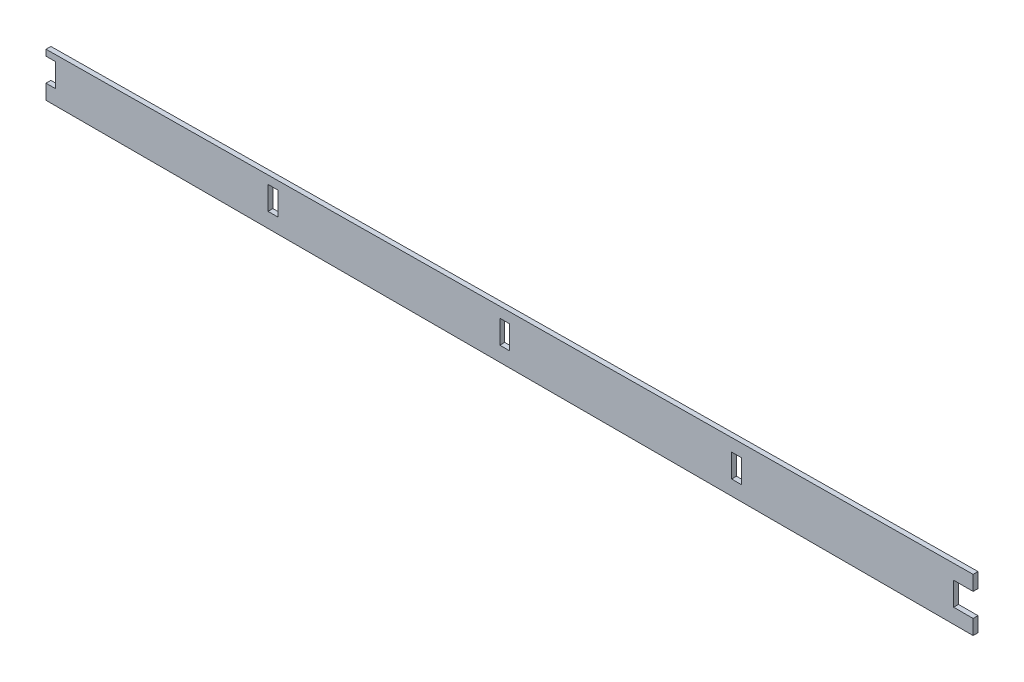
ISO-10303-21;
HEADER;
FILE_DESCRIPTION(('STEP AP214'),'2;1');
FILE_NAME('part.step','',(''),(''),'','','');
FILE_SCHEMA(('AUTOMOTIVE_DESIGN { 1 0 10303 214 1 1 1 1 }'));
ENDSEC;
DATA;
#1=APPLICATION_CONTEXT('core data for automotive mechanical design processes');
#2=APPLICATION_PROTOCOL_DEFINITION('international standard','automotive_design',2000,#1);
#3=PRODUCT_CONTEXT('',#1,'mechanical');
#4=PRODUCT('Part','Part','',(#3));
#5=PRODUCT_RELATED_PRODUCT_CATEGORY('part','',(#4));
#6=PRODUCT_DEFINITION_FORMATION('','',#4);
#7=PRODUCT_DEFINITION_CONTEXT('part definition',#1,'design');
#8=PRODUCT_DEFINITION('design','',#6,#7);
#9=PRODUCT_DEFINITION_SHAPE('','',#8);
#10=(LENGTH_UNIT() NAMED_UNIT(*) SI_UNIT(.MILLI.,.METRE.));
#11=(NAMED_UNIT(*) PLANE_ANGLE_UNIT() SI_UNIT($,.RADIAN.));
#12=(NAMED_UNIT(*) SI_UNIT($,.STERADIAN.) SOLID_ANGLE_UNIT());
#13=UNCERTAINTY_MEASURE_WITH_UNIT(LENGTH_MEASURE(1.E-05),#10,'distance_accuracy_value','');
#14=(GEOMETRIC_REPRESENTATION_CONTEXT(3) GLOBAL_UNCERTAINTY_ASSIGNED_CONTEXT((#13)) GLOBAL_UNIT_ASSIGNED_CONTEXT((#10,
#11,#12)) REPRESENTATION_CONTEXT('',''));
#15=CARTESIAN_POINT('',(0.,0.,0.));
#16=DIRECTION('',(0.,0.,1.));
#17=DIRECTION('',(1.,0.,0.));
#18=AXIS2_PLACEMENT_3D('',#15,#16,#17);
#19=CARTESIAN_POINT('',(0.,0.,1.5875));
#20=DIRECTION('',(0.,0.,-1.));
#21=DIRECTION('',(-1.,0.,0.));
#22=AXIS2_PLACEMENT_3D('',#19,#20,#21);
#23=PLANE('',#22);
#24=DIRECTION('',(0.,1.,0.));
#25=VECTOR('',#24,1.);
#26=CARTESIAN_POINT('',(-62.8042565693099,25.0075839146697,1.5875));
#27=LINE('',#26,#25);
#28=CARTESIAN_POINT('',(-62.8042565693099,25.0075839146697,1.5875));
#29=VERTEX_POINT('',#28);
#30=CARTESIAN_POINT('',(-62.8042565693098,32.6275839146696,1.5875));
#31=VERTEX_POINT('',#30);
#32=EDGE_CURVE('E229',#29,#31,#27,.T.);
#33=ORIENTED_EDGE('',*,*,#32,.F.);
#34=DIRECTION('',(1.,0.,0.));
#35=VECTOR('',#34,1.);
#36=CARTESIAN_POINT('',(-65.9792565693098,25.0075839146697,1.5875));
#37=LINE('',#36,#35);
#38=CARTESIAN_POINT('',(-65.9792565693098,25.0075839146697,1.5875));
#39=VERTEX_POINT('',#38);
#40=EDGE_CURVE('E237',#39,#29,#37,.T.);
#41=ORIENTED_EDGE('',*,*,#40,.F.);
#42=DIRECTION('',(0.,-1.,0.));
#43=VECTOR('',#42,1.);
#44=CARTESIAN_POINT('',(-65.9792565693098,32.6275839146697,1.5875));
#45=LINE('',#44,#43);
#46=CARTESIAN_POINT('',(-65.9792565693098,32.6275839146697,1.5875));
#47=VERTEX_POINT('',#46);
#48=EDGE_CURVE('E234',#47,#39,#45,.T.);
#49=ORIENTED_EDGE('',*,*,#48,.F.);
#50=DIRECTION('',(-1.,0.,0.));
#51=VECTOR('',#50,1.);
#52=CARTESIAN_POINT('',(-62.8042565693098,32.6275839146696,1.5875));
#53=LINE('',#52,#51);
#54=EDGE_CURVE('E231',#31,#47,#53,.T.);
#55=ORIENTED_EDGE('',*,*,#54,.F.);
#56=EDGE_LOOP('',(#33,#41,#49,#55));
#57=FACE_BOUND('',#56,.T.);
#58=DIRECTION('',(0.,1.,0.));
#59=VECTOR('',#58,1.);
#60=CARTESIAN_POINT('',(88.3257434306901,37.4664794760637,1.5875));
#61=LINE('',#60,#59);
#62=CARTESIAN_POINT('',(88.3257434306901,32.6275839146697,1.5875));
#63=VERTEX_POINT('',#62);
#64=CARTESIAN_POINT('',(88.3257434306901,37.4664794760637,1.5875));
#65=VERTEX_POINT('',#64);
#66=EDGE_CURVE('E291',#63,#65,#61,.T.);
#67=ORIENTED_EDGE('',*,*,#66,.T.);
#68=DIRECTION('',(-0.99995490736833,-0.00949648513894938,0.));
#69=VECTOR('',#68,1.);
#70=CARTESIAN_POINT('',(-213.93425656931,34.5959424378955,1.5875));
#71=LINE('',#70,#69);
#72=CARTESIAN_POINT('',(-213.93425656931,34.5959424378955,1.5875));
#73=VERTEX_POINT('',#72);
#74=EDGE_CURVE('E294',#65,#73,#71,.T.);
#75=ORIENTED_EDGE('',*,*,#74,.T.);
#76=DIRECTION('',(0.,-1.,0.));
#77=VECTOR('',#76,1.);
#78=CARTESIAN_POINT('',(-213.93425656931,32.6275839146697,1.5875));
#79=LINE('',#78,#77);
#80=CARTESIAN_POINT('',(-213.93425656931,32.6275839146697,1.5875));
#81=VERTEX_POINT('',#80);
#82=EDGE_CURVE('E297',#73,#81,#79,.T.);
#83=ORIENTED_EDGE('',*,*,#82,.T.);
#84=DIRECTION('',(1.,0.,0.));
#85=VECTOR('',#84,1.);
#86=CARTESIAN_POINT('',(-210.75925656931,32.6275839146697,1.5875));
#87=LINE('',#86,#85);
#88=CARTESIAN_POINT('',(-210.75925656931,32.6275839146697,1.5875));
#89=VERTEX_POINT('',#88);
#90=EDGE_CURVE('E299',#81,#89,#87,.T.);
#91=ORIENTED_EDGE('',*,*,#90,.T.);
#92=DIRECTION('',(0.,-1.,0.));
#93=VECTOR('',#92,1.);
#94=CARTESIAN_POINT('',(-210.75925656931,25.0075839146697,1.5875));
#95=LINE('',#94,#93);
#96=CARTESIAN_POINT('',(-210.75925656931,25.0075839146697,1.5875));
#97=VERTEX_POINT('',#96);
#98=EDGE_CURVE('E301',#89,#97,#95,.T.);
#99=ORIENTED_EDGE('',*,*,#98,.T.);
#100=DIRECTION('',(-1.,0.,0.));
#101=VECTOR('',#100,1.);
#102=CARTESIAN_POINT('',(-213.93425656931,25.0075839146697,1.5875));
#103=LINE('',#102,#101);
#104=CARTESIAN_POINT('',(-213.93425656931,25.0075839146697,1.5875));
#105=VERTEX_POINT('',#104);
#106=EDGE_CURVE('E303',#97,#105,#103,.T.);
#107=ORIENTED_EDGE('',*,*,#106,.T.);
#108=DIRECTION('',(0.,-1.,0.));
#109=VECTOR('',#108,1.);
#110=CARTESIAN_POINT('',(-213.93425656931,20.1686521639343,1.5875));
#111=LINE('',#110,#109);
#112=CARTESIAN_POINT('',(-213.93425656931,20.1686521639343,1.5875));
#113=VERTEX_POINT('',#112);
#114=EDGE_CURVE('E305',#105,#113,#111,.T.);
#115=ORIENTED_EDGE('',*,*,#114,.T.);
#116=DIRECTION('',(1.,0.,0.));
#117=VECTOR('',#116,1.);
#118=CARTESIAN_POINT('',(88.3257434306901,20.1686521639343,1.5875));
#119=LINE('',#118,#117);
#120=CARTESIAN_POINT('',(88.3257434306901,20.1686521639343,1.5875));
#121=VERTEX_POINT('',#120);
#122=EDGE_CURVE('E307',#113,#121,#119,.T.);
#123=ORIENTED_EDGE('',*,*,#122,.T.);
#124=DIRECTION('',(0.,1.,0.));
#125=VECTOR('',#124,1.);
#126=CARTESIAN_POINT('',(88.3257434306901,25.0075839146696,1.5875));
#127=LINE('',#126,#125);
#128=CARTESIAN_POINT('',(88.3257434306901,25.0075839146696,1.5875));
#129=VERTEX_POINT('',#128);
#130=EDGE_CURVE('E309',#121,#129,#127,.T.);
#131=ORIENTED_EDGE('',*,*,#130,.T.);
#132=DIRECTION('',(-1.,0.,0.));
#133=VECTOR('',#132,1.);
#134=CARTESIAN_POINT('',(81.9757434306901,25.0075839146697,1.5875));
#135=LINE('',#134,#133);
#136=CARTESIAN_POINT('',(81.9757434306901,25.0075839146697,1.5875));
#137=VERTEX_POINT('',#136);
#138=EDGE_CURVE('E311',#129,#137,#135,.T.);
#139=ORIENTED_EDGE('',*,*,#138,.T.);
#140=DIRECTION('',(0.,1.,0.));
#141=VECTOR('',#140,1.);
#142=CARTESIAN_POINT('',(81.9757434306901,32.6275839146697,1.5875));
#143=LINE('',#142,#141);
#144=CARTESIAN_POINT('',(81.9757434306901,32.6275839146697,1.5875));
#145=VERTEX_POINT('',#144);
#146=EDGE_CURVE('E313',#137,#145,#143,.T.);
#147=ORIENTED_EDGE('',*,*,#146,.T.);
#148=DIRECTION('',(1.,0.,0.));
#149=VECTOR('',#148,1.);
#150=CARTESIAN_POINT('',(88.3257434306901,32.6275839146697,1.5875));
#151=LINE('',#150,#149);
#152=EDGE_CURVE('E315',#145,#63,#151,.T.);
#153=ORIENTED_EDGE('',*,*,#152,.T.);
#154=EDGE_LOOP('',(#67,#75,#83,#91,#99,#107,#115,#123,#131,#139,#147,#153));
#155=FACE_BOUND('',#154,.T.);
#156=DIRECTION('',(0.,1.,0.));
#157=VECTOR('',#156,1.);
#158=CARTESIAN_POINT('',(-138.36925656931,32.6275839146697,1.5875));
#159=LINE('',#158,#157);
#160=CARTESIAN_POINT('',(-138.36925656931,25.0075839146697,1.5875));
#161=VERTEX_POINT('',#160);
#162=CARTESIAN_POINT('',(-138.36925656931,32.6275839146697,1.5875));
#163=VERTEX_POINT('',#162);
#164=EDGE_CURVE('E260',#161,#163,#159,.T.);
#165=ORIENTED_EDGE('',*,*,#164,.F.);
#166=DIRECTION('',(1.,0.,0.));
#167=VECTOR('',#166,1.);
#168=CARTESIAN_POINT('',(-138.36925656931,25.0075839146697,1.5875));
#169=LINE('',#168,#167);
#170=CARTESIAN_POINT('',(-141.54425656931,25.0075839146696,1.5875));
#171=VERTEX_POINT('',#170);
#172=EDGE_CURVE('E268',#171,#161,#169,.T.);
#173=ORIENTED_EDGE('',*,*,#172,.F.);
#174=DIRECTION('',(0.,-1.,0.));
#175=VECTOR('',#174,1.);
#176=CARTESIAN_POINT('',(-141.54425656931,25.0075839146696,1.5875));
#177=LINE('',#176,#175);
#178=CARTESIAN_POINT('',(-141.54425656931,32.6275839146697,1.5875));
#179=VERTEX_POINT('',#178);
#180=EDGE_CURVE('E265',#179,#171,#177,.T.);
#181=ORIENTED_EDGE('',*,*,#180,.F.);
#182=DIRECTION('',(-1.,0.,0.));
#183=VECTOR('',#182,1.);
#184=CARTESIAN_POINT('',(-141.54425656931,32.6275839146697,1.5875));
#185=LINE('',#184,#183);
#186=EDGE_CURVE('E262',#163,#179,#185,.T.);
#187=ORIENTED_EDGE('',*,*,#186,.F.);
#188=EDGE_LOOP('',(#165,#173,#181,#187));
#189=FACE_BOUND('',#188,.T.);
#190=DIRECTION('',(-1.,0.,0.));
#191=VECTOR('',#190,1.);
#192=CARTESIAN_POINT('',(9.5857434306901,32.6275839146697,1.5875));
#193=LINE('',#192,#191);
#194=CARTESIAN_POINT('',(12.7607434306901,32.6275839146697,1.5875));
#195=VERTEX_POINT('',#194);
#196=CARTESIAN_POINT('',(9.5857434306901,32.6275839146697,1.5875));
#197=VERTEX_POINT('',#196);
#198=EDGE_CURVE('E193',#195,#197,#193,.T.);
#199=ORIENTED_EDGE('',*,*,#198,.F.);
#200=DIRECTION('',(0.,1.,0.));
#201=VECTOR('',#200,1.);
#202=CARTESIAN_POINT('',(12.7607434306901,32.6275839146697,1.5875));
#203=LINE('',#202,#201);
#204=CARTESIAN_POINT('',(12.7607434306901,25.0075839146697,1.5875));
#205=VERTEX_POINT('',#204);
#206=EDGE_CURVE('E215',#205,#195,#203,.T.);
#207=ORIENTED_EDGE('',*,*,#206,.F.);
#208=DIRECTION('',(1.,0.,0.));
#209=VECTOR('',#208,1.);
#210=CARTESIAN_POINT('',(12.7607434306901,25.0075839146697,1.5875));
#211=LINE('',#210,#209);
#212=CARTESIAN_POINT('',(9.5857434306901,25.0075839146697,1.5875));
#213=VERTEX_POINT('',#212);
#214=EDGE_CURVE('E213',#213,#205,#211,.T.);
#215=ORIENTED_EDGE('',*,*,#214,.F.);
#216=DIRECTION('',(0.,-1.,0.));
#217=VECTOR('',#216,1.);
#218=CARTESIAN_POINT('',(9.5857434306901,25.0075839146697,1.5875));
#219=LINE('',#218,#217);
#220=EDGE_CURVE('E201',#197,#213,#219,.T.);
#221=ORIENTED_EDGE('',*,*,#220,.F.);
#222=EDGE_LOOP('',(#199,#207,#215,#221));
#223=FACE_BOUND('',#222,.T.);
#224=ADVANCED_FACE('F32',(#57,#155,#189,#223),#23,.F.);
#225=CARTESIAN_POINT('',(0.,0.,0.));
#226=DIRECTION('',(0.,0.,-1.));
#227=DIRECTION('',(-1.,0.,0.));
#228=AXIS2_PLACEMENT_3D('',#225,#226,#227);
#229=PLANE('',#228);
#230=DIRECTION('',(0.,1.,0.));
#231=VECTOR('',#230,1.);
#232=CARTESIAN_POINT('',(88.3257434306901,37.4664794760637,0.));
#233=LINE('',#232,#231);
#234=CARTESIAN_POINT('',(88.3257434306901,32.6275839146697,0.));
#235=VERTEX_POINT('',#234);
#236=CARTESIAN_POINT('',(88.3257434306901,37.4664794760637,0.));
#237=VERTEX_POINT('',#236);
#238=EDGE_CURVE('E290',#235,#237,#233,.T.);
#239=ORIENTED_EDGE('',*,*,#238,.F.);
#240=DIRECTION('',(1.,0.,0.));
#241=VECTOR('',#240,1.);
#242=CARTESIAN_POINT('',(88.3257434306901,32.6275839146697,0.));
#243=LINE('',#242,#241);
#244=CARTESIAN_POINT('',(81.9757434306901,32.6275839146697,0.));
#245=VERTEX_POINT('',#244);
#246=EDGE_CURVE('E295',#245,#235,#243,.T.);
#247=ORIENTED_EDGE('',*,*,#246,.F.);
#248=DIRECTION('',(0.,1.,0.));
#249=VECTOR('',#248,1.);
#250=CARTESIAN_POINT('',(81.9757434306901,32.6275839146697,0.));
#251=LINE('',#250,#249);
#252=CARTESIAN_POINT('',(81.9757434306901,25.0075839146697,0.));
#253=VERTEX_POINT('',#252);
#254=EDGE_CURVE('E338',#253,#245,#251,.T.);
#255=ORIENTED_EDGE('',*,*,#254,.F.);
#256=DIRECTION('',(-1.,0.,0.));
#257=VECTOR('',#256,1.);
#258=CARTESIAN_POINT('',(81.9757434306901,25.0075839146697,0.));
#259=LINE('',#258,#257);
#260=CARTESIAN_POINT('',(88.3257434306901,25.0075839146696,0.));
#261=VERTEX_POINT('',#260);
#262=EDGE_CURVE('E336',#261,#253,#259,.T.);
#263=ORIENTED_EDGE('',*,*,#262,.F.);
#264=DIRECTION('',(0.,1.,0.));
#265=VECTOR('',#264,1.);
#266=CARTESIAN_POINT('',(88.3257434306901,25.0075839146696,0.));
#267=LINE('',#266,#265);
#268=CARTESIAN_POINT('',(88.3257434306901,20.1686521639343,0.));
#269=VERTEX_POINT('',#268);
#270=EDGE_CURVE('E334',#269,#261,#267,.T.);
#271=ORIENTED_EDGE('',*,*,#270,.F.);
#272=DIRECTION('',(1.,0.,0.));
#273=VECTOR('',#272,1.);
#274=CARTESIAN_POINT('',(88.3257434306901,20.1686521639343,0.));
#275=LINE('',#274,#273);
#276=CARTESIAN_POINT('',(-213.93425656931,20.1686521639343,0.));
#277=VERTEX_POINT('',#276);
#278=EDGE_CURVE('E332',#277,#269,#275,.T.);
#279=ORIENTED_EDGE('',*,*,#278,.F.);
#280=DIRECTION('',(0.,-1.,0.));
#281=VECTOR('',#280,1.);
#282=CARTESIAN_POINT('',(-213.93425656931,20.1686521639343,0.));
#283=LINE('',#282,#281);
#284=CARTESIAN_POINT('',(-213.93425656931,25.0075839146697,0.));
#285=VERTEX_POINT('',#284);
#286=EDGE_CURVE('E330',#285,#277,#283,.T.);
#287=ORIENTED_EDGE('',*,*,#286,.F.);
#288=DIRECTION('',(-1.,0.,0.));
#289=VECTOR('',#288,1.);
#290=CARTESIAN_POINT('',(-213.93425656931,25.0075839146697,0.));
#291=LINE('',#290,#289);
#292=CARTESIAN_POINT('',(-210.75925656931,25.0075839146697,0.));
#293=VERTEX_POINT('',#292);
#294=EDGE_CURVE('E328',#293,#285,#291,.T.);
#295=ORIENTED_EDGE('',*,*,#294,.F.);
#296=DIRECTION('',(0.,-1.,0.));
#297=VECTOR('',#296,1.);
#298=CARTESIAN_POINT('',(-210.75925656931,25.0075839146697,0.));
#299=LINE('',#298,#297);
#300=CARTESIAN_POINT('',(-210.75925656931,32.6275839146697,0.));
#301=VERTEX_POINT('',#300);
#302=EDGE_CURVE('E326',#301,#293,#299,.T.);
#303=ORIENTED_EDGE('',*,*,#302,.F.);
#304=DIRECTION('',(1.,0.,0.));
#305=VECTOR('',#304,1.);
#306=CARTESIAN_POINT('',(-210.75925656931,32.6275839146697,0.));
#307=LINE('',#306,#305);
#308=CARTESIAN_POINT('',(-213.93425656931,32.6275839146697,0.));
#309=VERTEX_POINT('',#308);
#310=EDGE_CURVE('E324',#309,#301,#307,.T.);
#311=ORIENTED_EDGE('',*,*,#310,.F.);
#312=DIRECTION('',(0.,-1.,0.));
#313=VECTOR('',#312,1.);
#314=CARTESIAN_POINT('',(-213.93425656931,32.6275839146697,0.));
#315=LINE('',#314,#313);
#316=CARTESIAN_POINT('',(-213.93425656931,34.5959424378955,0.));
#317=VERTEX_POINT('',#316);
#318=EDGE_CURVE('E322',#317,#309,#315,.T.);
#319=ORIENTED_EDGE('',*,*,#318,.F.);
#320=DIRECTION('',(-0.99995490736833,-0.00949648513894938,0.));
#321=VECTOR('',#320,1.);
#322=CARTESIAN_POINT('',(-213.93425656931,34.5959424378955,0.));
#323=LINE('',#322,#321);
#324=EDGE_CURVE('E320',#237,#317,#323,.T.);
#325=ORIENTED_EDGE('',*,*,#324,.F.);
#326=EDGE_LOOP('',(#239,#247,#255,#263,#271,#279,#287,#295,#303,#311,#319,#325));
#327=FACE_BOUND('',#326,.T.);
#328=DIRECTION('',(1.,0.,0.));
#329=VECTOR('',#328,1.);
#330=CARTESIAN_POINT('',(-138.36925656931,25.0075839146697,0.));
#331=LINE('',#330,#329);
#332=CARTESIAN_POINT('',(-141.54425656931,25.0075839146696,0.));
#333=VERTEX_POINT('',#332);
#334=CARTESIAN_POINT('',(-138.36925656931,25.0075839146697,0.));
#335=VERTEX_POINT('',#334);
#336=EDGE_CURVE('E263',#333,#335,#331,.T.);
#337=ORIENTED_EDGE('',*,*,#336,.T.);
#338=DIRECTION('',(0.,1.,0.));
#339=VECTOR('',#338,1.);
#340=CARTESIAN_POINT('',(-138.36925656931,32.6275839146697,0.));
#341=LINE('',#340,#339);
#342=CARTESIAN_POINT('',(-138.36925656931,32.6275839146697,0.));
#343=VERTEX_POINT('',#342);
#344=EDGE_CURVE('E259',#335,#343,#341,.T.);
#345=ORIENTED_EDGE('',*,*,#344,.T.);
#346=DIRECTION('',(-1.,0.,0.));
#347=VECTOR('',#346,1.);
#348=CARTESIAN_POINT('',(-141.54425656931,32.6275839146697,0.));
#349=LINE('',#348,#347);
#350=CARTESIAN_POINT('',(-141.54425656931,32.6275839146697,0.));
#351=VERTEX_POINT('',#350);
#352=EDGE_CURVE('E273',#343,#351,#349,.T.);
#353=ORIENTED_EDGE('',*,*,#352,.T.);
#354=DIRECTION('',(0.,-1.,0.));
#355=VECTOR('',#354,1.);
#356=CARTESIAN_POINT('',(-141.54425656931,25.0075839146696,0.));
#357=LINE('',#356,#355);
#358=EDGE_CURVE('E276',#351,#333,#357,.T.);
#359=ORIENTED_EDGE('',*,*,#358,.T.);
#360=EDGE_LOOP('',(#337,#345,#353,#359));
#361=FACE_BOUND('',#360,.T.);
#362=DIRECTION('',(1.,0.,0.));
#363=VECTOR('',#362,1.);
#364=CARTESIAN_POINT('',(-65.9792565693098,25.0075839146697,0.));
#365=LINE('',#364,#363);
#366=CARTESIAN_POINT('',(-65.9792565693098,25.0075839146697,0.));
#367=VERTEX_POINT('',#366);
#368=CARTESIAN_POINT('',(-62.8042565693099,25.0075839146697,0.));
#369=VERTEX_POINT('',#368);
#370=EDGE_CURVE('E232',#367,#369,#365,.T.);
#371=ORIENTED_EDGE('',*,*,#370,.T.);
#372=DIRECTION('',(0.,1.,0.));
#373=VECTOR('',#372,1.);
#374=CARTESIAN_POINT('',(-62.8042565693099,25.0075839146697,0.));
#375=LINE('',#374,#373);
#376=CARTESIAN_POINT('',(-62.8042565693098,32.6275839146696,0.));
#377=VERTEX_POINT('',#376);
#378=EDGE_CURVE('E209',#369,#377,#375,.T.);
#379=ORIENTED_EDGE('',*,*,#378,.T.);
#380=DIRECTION('',(-1.,0.,0.));
#381=VECTOR('',#380,1.);
#382=CARTESIAN_POINT('',(-62.8042565693098,32.6275839146696,0.));
#383=LINE('',#382,#381);
#384=CARTESIAN_POINT('',(-65.9792565693098,32.6275839146697,0.));
#385=VERTEX_POINT('',#384);
#386=EDGE_CURVE('E242',#377,#385,#383,.T.);
#387=ORIENTED_EDGE('',*,*,#386,.T.);
#388=DIRECTION('',(0.,-1.,0.));
#389=VECTOR('',#388,1.);
#390=CARTESIAN_POINT('',(-65.9792565693098,32.6275839146697,0.));
#391=LINE('',#390,#389);
#392=EDGE_CURVE('E245',#385,#367,#391,.T.);
#393=ORIENTED_EDGE('',*,*,#392,.T.);
#394=EDGE_LOOP('',(#371,#379,#387,#393));
#395=FACE_BOUND('',#394,.T.);
#396=DIRECTION('',(0.,1.,0.));
#397=VECTOR('',#396,1.);
#398=CARTESIAN_POINT('',(12.7607434306901,32.6275839146697,0.));
#399=LINE('',#398,#397);
#400=CARTESIAN_POINT('',(12.7607434306901,25.0075839146697,0.));
#401=VERTEX_POINT('',#400);
#402=CARTESIAN_POINT('',(12.7607434306901,32.6275839146697,0.));
#403=VERTEX_POINT('',#402);
#404=EDGE_CURVE('E202',#401,#403,#399,.T.);
#405=ORIENTED_EDGE('',*,*,#404,.T.);
#406=DIRECTION('',(-1.,0.,0.));
#407=VECTOR('',#406,1.);
#408=CARTESIAN_POINT('',(9.5857434306901,32.6275839146697,0.));
#409=LINE('',#408,#407);
#410=CARTESIAN_POINT('',(9.5857434306901,32.6275839146697,0.));
#411=VERTEX_POINT('',#410);
#412=EDGE_CURVE('E55',#403,#411,#409,.T.);
#413=ORIENTED_EDGE('',*,*,#412,.T.);
#414=DIRECTION('',(0.,-1.,0.));
#415=VECTOR('',#414,1.);
#416=CARTESIAN_POINT('',(9.5857434306901,25.0075839146697,0.));
#417=LINE('',#416,#415);
#418=CARTESIAN_POINT('',(9.5857434306901,25.0075839146697,0.));
#419=VERTEX_POINT('',#418);
#420=EDGE_CURVE('E208',#411,#419,#417,.T.);
#421=ORIENTED_EDGE('',*,*,#420,.T.);
#422=DIRECTION('',(1.,0.,0.));
#423=VECTOR('',#422,1.);
#424=CARTESIAN_POINT('',(12.7607434306901,25.0075839146697,0.));
#425=LINE('',#424,#423);
#426=EDGE_CURVE('E221',#419,#401,#425,.T.);
#427=ORIENTED_EDGE('',*,*,#426,.T.);
#428=EDGE_LOOP('',(#405,#413,#421,#427));
#429=FACE_BOUND('',#428,.T.);
#430=ADVANCED_FACE('F380',(#327,#361,#395,#429),#229,.T.);
#431=CARTESIAN_POINT('',(88.3257434306901,37.4664794760637,1.5875));
#432=DIRECTION('',(-1.,0.,0.));
#433=DIRECTION('',(0.,0.,1.));
#434=AXIS2_PLACEMENT_3D('',#431,#432,#433);
#435=PLANE('',#434);
#436=ORIENTED_EDGE('',*,*,#238,.T.);
#437=DIRECTION('',(0.,0.,-1.));
#438=VECTOR('',#437,1.);
#439=CARTESIAN_POINT('',(88.3257434306901,37.4664794760637,1.5875));
#440=LINE('',#439,#438);
#441=EDGE_CURVE('E11',#65,#237,#440,.T.);
#442=ORIENTED_EDGE('',*,*,#441,.F.);
#443=ORIENTED_EDGE('',*,*,#66,.F.);
#444=DIRECTION('',(0.,0.,-1.));
#445=VECTOR('',#444,1.);
#446=CARTESIAN_POINT('',(88.3257434306901,32.6275839146697,1.5875));
#447=LINE('',#446,#445);
#448=EDGE_CURVE('E317',#63,#235,#447,.T.);
#449=ORIENTED_EDGE('',*,*,#448,.T.);
#450=EDGE_LOOP('',(#436,#442,#443,#449));
#451=FACE_BOUND('',#450,.T.);
#452=ADVANCED_FACE('F34',(#451),#435,.F.);
#453=CARTESIAN_POINT('',(-213.93425656931,34.5959424378955,1.5875));
#454=DIRECTION('',(0.00949648513894938,-0.99995490736833,0.));
#455=DIRECTION('',(0.99995490736833,0.00949648513894938,0.));
#456=AXIS2_PLACEMENT_3D('',#453,#454,#455);
#457=PLANE('',#456);
#458=ORIENTED_EDGE('',*,*,#324,.T.);
#459=DIRECTION('',(0.,0.,-1.));
#460=VECTOR('',#459,1.);
#461=CARTESIAN_POINT('',(-213.93425656931,34.5959424378955,1.5875));
#462=LINE('',#461,#460);
#463=EDGE_CURVE('E40',#73,#317,#462,.T.);
#464=ORIENTED_EDGE('',*,*,#463,.F.);
#465=ORIENTED_EDGE('',*,*,#74,.F.);
#466=ORIENTED_EDGE('',*,*,#441,.T.);
#467=EDGE_LOOP('',(#458,#464,#465,#466));
#468=FACE_BOUND('',#467,.T.);
#469=ADVANCED_FACE('F398',(#468),#457,.F.);
#470=CARTESIAN_POINT('',(-213.93425656931,32.6275839146697,1.5875));
#471=DIRECTION('',(1.,0.,0.));
#472=DIRECTION('',(0.,0.,-1.));
#473=AXIS2_PLACEMENT_3D('',#470,#471,#472);
#474=PLANE('',#473);
#475=ORIENTED_EDGE('',*,*,#318,.T.);
#476=DIRECTION('',(0.,0.,-1.));
#477=VECTOR('',#476,1.);
#478=CARTESIAN_POINT('',(-213.93425656931,32.6275839146697,1.5875));
#479=LINE('',#478,#477);
#480=EDGE_CURVE('E367',#81,#309,#479,.T.);
#481=ORIENTED_EDGE('',*,*,#480,.F.);
#482=ORIENTED_EDGE('',*,*,#82,.F.);
#483=ORIENTED_EDGE('',*,*,#463,.T.);
#484=EDGE_LOOP('',(#475,#481,#482,#483));
#485=FACE_BOUND('',#484,.T.);
#486=ADVANCED_FACE('F374',(#485),#474,.F.);
#487=CARTESIAN_POINT('',(-210.75925656931,32.6275839146697,1.5875));
#488=DIRECTION('',(0.,1.,0.));
#489=DIRECTION('',(0.,0.,1.));
#490=AXIS2_PLACEMENT_3D('',#487,#488,#489);
#491=PLANE('',#490);
#492=ORIENTED_EDGE('',*,*,#310,.T.);
#493=DIRECTION('',(0.,0.,-1.));
#494=VECTOR('',#493,1.);
#495=CARTESIAN_POINT('',(-210.75925656931,32.6275839146697,1.5875));
#496=LINE('',#495,#494);
#497=EDGE_CURVE('E364',#89,#301,#496,.T.);
#498=ORIENTED_EDGE('',*,*,#497,.F.);
#499=ORIENTED_EDGE('',*,*,#90,.F.);
#500=ORIENTED_EDGE('',*,*,#480,.T.);
#501=EDGE_LOOP('',(#492,#498,#499,#500));
#502=FACE_BOUND('',#501,.T.);
#503=ADVANCED_FACE('F386',(#502),#491,.F.);
#504=CARTESIAN_POINT('',(-210.75925656931,25.0075839146697,1.5875));
#505=DIRECTION('',(1.,0.,0.));
#506=DIRECTION('',(0.,1.,0.));
#507=AXIS2_PLACEMENT_3D('',#504,#505,#506);
#508=PLANE('',#507);
#509=ORIENTED_EDGE('',*,*,#302,.T.);
#510=DIRECTION('',(0.,0.,-1.));
#511=VECTOR('',#510,1.);
#512=CARTESIAN_POINT('',(-210.75925656931,25.0075839146697,1.5875));
#513=LINE('',#512,#511);
#514=EDGE_CURVE('E361',#97,#293,#513,.T.);
#515=ORIENTED_EDGE('',*,*,#514,.F.);
#516=ORIENTED_EDGE('',*,*,#98,.F.);
#517=ORIENTED_EDGE('',*,*,#497,.T.);
#518=EDGE_LOOP('',(#509,#515,#516,#517));
#519=FACE_BOUND('',#518,.T.);
#520=ADVANCED_FACE('F390',(#519),#508,.F.);
#521=CARTESIAN_POINT('',(-213.93425656931,25.0075839146697,1.5875));
#522=DIRECTION('',(0.,-1.,0.));
#523=DIRECTION('',(0.,0.,-1.));
#524=AXIS2_PLACEMENT_3D('',#521,#522,#523);
#525=PLANE('',#524);
#526=ORIENTED_EDGE('',*,*,#294,.T.);
#527=DIRECTION('',(0.,0.,-1.));
#528=VECTOR('',#527,1.);
#529=CARTESIAN_POINT('',(-213.93425656931,25.0075839146697,1.5875));
#530=LINE('',#529,#528);
#531=EDGE_CURVE('E358',#105,#285,#530,.T.);
#532=ORIENTED_EDGE('',*,*,#531,.F.);
#533=ORIENTED_EDGE('',*,*,#106,.F.);
#534=ORIENTED_EDGE('',*,*,#514,.T.);
#535=EDGE_LOOP('',(#526,#532,#533,#534));
#536=FACE_BOUND('',#535,.T.);
#537=ADVANCED_FACE('F431',(#536),#525,.F.);
#538=CARTESIAN_POINT('',(-213.93425656931,20.1686521639343,1.5875));
#539=DIRECTION('',(1.,0.,0.));
#540=DIRECTION('',(0.,0.,-1.));
#541=AXIS2_PLACEMENT_3D('',#538,#539,#540);
#542=PLANE('',#541);
#543=ORIENTED_EDGE('',*,*,#286,.T.);
#544=DIRECTION('',(0.,0.,-1.));
#545=VECTOR('',#544,1.);
#546=CARTESIAN_POINT('',(-213.93425656931,20.1686521639343,1.5875));
#547=LINE('',#546,#545);
#548=EDGE_CURVE('E355',#113,#277,#547,.T.);
#549=ORIENTED_EDGE('',*,*,#548,.F.);
#550=ORIENTED_EDGE('',*,*,#114,.F.);
#551=ORIENTED_EDGE('',*,*,#531,.T.);
#552=EDGE_LOOP('',(#543,#549,#550,#551));
#553=FACE_BOUND('',#552,.T.);
#554=ADVANCED_FACE('F429',(#553),#542,.F.);
#555=CARTESIAN_POINT('',(88.3257434306901,20.1686521639343,1.5875));
#556=DIRECTION('',(0.,1.,0.));
#557=DIRECTION('',(0.,0.,1.));
#558=AXIS2_PLACEMENT_3D('',#555,#556,#557);
#559=PLANE('',#558);
#560=ORIENTED_EDGE('',*,*,#278,.T.);
#561=DIRECTION('',(0.,0.,-1.));
#562=VECTOR('',#561,1.);
#563=CARTESIAN_POINT('',(88.3257434306901,20.1686521639343,1.5875));
#564=LINE('',#563,#562);
#565=EDGE_CURVE('E352',#121,#269,#564,.T.);
#566=ORIENTED_EDGE('',*,*,#565,.F.);
#567=ORIENTED_EDGE('',*,*,#122,.F.);
#568=ORIENTED_EDGE('',*,*,#548,.T.);
#569=EDGE_LOOP('',(#560,#566,#567,#568));
#570=FACE_BOUND('',#569,.T.);
#571=ADVANCED_FACE('F425',(#570),#559,.F.);
#572=CARTESIAN_POINT('',(88.3257434306901,25.0075839146696,1.5875));
#573=DIRECTION('',(-1.,0.,0.));
#574=DIRECTION('',(0.,0.,1.));
#575=AXIS2_PLACEMENT_3D('',#572,#573,#574);
#576=PLANE('',#575);
#577=ORIENTED_EDGE('',*,*,#270,.T.);
#578=DIRECTION('',(0.,0.,-1.));
#579=VECTOR('',#578,1.);
#580=CARTESIAN_POINT('',(88.3257434306901,25.0075839146696,1.5875));
#581=LINE('',#580,#579);
#582=EDGE_CURVE('E349',#129,#261,#581,.T.);
#583=ORIENTED_EDGE('',*,*,#582,.F.);
#584=ORIENTED_EDGE('',*,*,#130,.F.);
#585=ORIENTED_EDGE('',*,*,#565,.T.);
#586=EDGE_LOOP('',(#577,#583,#584,#585));
#587=FACE_BOUND('',#586,.T.);
#588=ADVANCED_FACE('F420',(#587),#576,.F.);
#589=CARTESIAN_POINT('',(81.9757434306901,25.0075839146697,1.5875));
#590=DIRECTION('',(0.,-1.,0.));
#591=DIRECTION('',(1.,0.,0.));
#592=AXIS2_PLACEMENT_3D('',#589,#590,#591);
#593=PLANE('',#592);
#594=ORIENTED_EDGE('',*,*,#262,.T.);
#595=DIRECTION('',(0.,0.,-1.));
#596=VECTOR('',#595,1.);
#597=CARTESIAN_POINT('',(81.9757434306901,25.0075839146697,1.5875));
#598=LINE('',#597,#596);
#599=EDGE_CURVE('E346',#137,#253,#598,.T.);
#600=ORIENTED_EDGE('',*,*,#599,.F.);
#601=ORIENTED_EDGE('',*,*,#138,.F.);
#602=ORIENTED_EDGE('',*,*,#582,.T.);
#603=EDGE_LOOP('',(#594,#600,#601,#602));
#604=FACE_BOUND('',#603,.T.);
#605=ADVANCED_FACE('F414',(#604),#593,.F.);
#606=CARTESIAN_POINT('',(81.9757434306901,32.6275839146697,1.5875));
#607=DIRECTION('',(-1.,0.,0.));
#608=DIRECTION('',(0.,0.,1.));
#609=AXIS2_PLACEMENT_3D('',#606,#607,#608);
#610=PLANE('',#609);
#611=ORIENTED_EDGE('',*,*,#254,.T.);
#612=DIRECTION('',(0.,0.,-1.));
#613=VECTOR('',#612,1.);
#614=CARTESIAN_POINT('',(81.9757434306901,32.6275839146697,1.5875));
#615=LINE('',#614,#613);
#616=EDGE_CURVE('E343',#145,#245,#615,.T.);
#617=ORIENTED_EDGE('',*,*,#616,.F.);
#618=ORIENTED_EDGE('',*,*,#146,.F.);
#619=ORIENTED_EDGE('',*,*,#599,.T.);
#620=EDGE_LOOP('',(#611,#617,#618,#619));
#621=FACE_BOUND('',#620,.T.);
#622=ADVANCED_FACE('F410',(#621),#610,.F.);
#623=CARTESIAN_POINT('',(88.3257434306901,32.6275839146697,1.5875));
#624=DIRECTION('',(0.,1.,0.));
#625=DIRECTION('',(-1.,0.,0.));
#626=AXIS2_PLACEMENT_3D('',#623,#624,#625);
#627=PLANE('',#626);
#628=ORIENTED_EDGE('',*,*,#246,.T.);
#629=ORIENTED_EDGE('',*,*,#448,.F.);
#630=ORIENTED_EDGE('',*,*,#152,.F.);
#631=ORIENTED_EDGE('',*,*,#616,.T.);
#632=EDGE_LOOP('',(#628,#629,#630,#631));
#633=FACE_BOUND('',#632,.T.);
#634=ADVANCED_FACE('F405',(#633),#627,.F.);
#635=CARTESIAN_POINT('',(-138.36925656931,32.6275839146697,1.5875));
#636=DIRECTION('',(-1.,0.,0.));
#637=DIRECTION('',(0.,-1.,0.));
#638=AXIS2_PLACEMENT_3D('',#635,#636,#637);
#639=PLANE('',#638);
#640=ORIENTED_EDGE('',*,*,#344,.F.);
#641=DIRECTION('',(0.,0.,-1.));
#642=VECTOR('',#641,1.);
#643=CARTESIAN_POINT('',(-138.36925656931,25.0075839146697,1.5875));
#644=LINE('',#643,#642);
#645=EDGE_CURVE('E270',#161,#335,#644,.T.);
#646=ORIENTED_EDGE('',*,*,#645,.F.);
#647=ORIENTED_EDGE('',*,*,#164,.T.);
#648=DIRECTION('',(0.,0.,-1.));
#649=VECTOR('',#648,1.);
#650=CARTESIAN_POINT('',(-138.36925656931,32.6275839146697,1.5875));
#651=LINE('',#650,#649);
#652=EDGE_CURVE('E287',#163,#343,#651,.T.);
#653=ORIENTED_EDGE('',*,*,#652,.T.);
#654=EDGE_LOOP('',(#640,#646,#647,#653));
#655=FACE_BOUND('',#654,.T.);
#656=ADVANCED_FACE('F449',(#655),#639,.T.);
#657=CARTESIAN_POINT('',(-141.54425656931,32.6275839146697,1.5875));
#658=DIRECTION('',(0.,-1.,0.));
#659=DIRECTION('',(0.,0.,-1.));
#660=AXIS2_PLACEMENT_3D('',#657,#658,#659);
#661=PLANE('',#660);
#662=ORIENTED_EDGE('',*,*,#352,.F.);
#663=ORIENTED_EDGE('',*,*,#652,.F.);
#664=ORIENTED_EDGE('',*,*,#186,.T.);
#665=DIRECTION('',(0.,0.,-1.));
#666=VECTOR('',#665,1.);
#667=CARTESIAN_POINT('',(-141.54425656931,32.6275839146697,1.5875));
#668=LINE('',#667,#666);
#669=EDGE_CURVE('E285',#179,#351,#668,.T.);
#670=ORIENTED_EDGE('',*,*,#669,.T.);
#671=EDGE_LOOP('',(#662,#663,#664,#670));
#672=FACE_BOUND('',#671,.T.);
#673=ADVANCED_FACE('F487',(#672),#661,.T.);
#674=CARTESIAN_POINT('',(-141.54425656931,25.0075839146696,1.5875));
#675=DIRECTION('',(1.,0.,0.));
#676=DIRECTION('',(0.,1.,0.));
#677=AXIS2_PLACEMENT_3D('',#674,#675,#676);
#678=PLANE('',#677);
#679=ORIENTED_EDGE('',*,*,#358,.F.);
#680=ORIENTED_EDGE('',*,*,#669,.F.);
#681=ORIENTED_EDGE('',*,*,#180,.T.);
#682=DIRECTION('',(0.,0.,-1.));
#683=VECTOR('',#682,1.);
#684=CARTESIAN_POINT('',(-141.54425656931,25.0075839146696,1.5875));
#685=LINE('',#684,#683);
#686=EDGE_CURVE('E283',#171,#333,#685,.T.);
#687=ORIENTED_EDGE('',*,*,#686,.T.);
#688=EDGE_LOOP('',(#679,#680,#681,#687));
#689=FACE_BOUND('',#688,.T.);
#690=ADVANCED_FACE('F494',(#689),#678,.T.);
#691=CARTESIAN_POINT('',(-138.36925656931,25.0075839146697,1.5875));
#692=DIRECTION('',(0.,1.,0.));
#693=DIRECTION('',(-1.,0.,0.));
#694=AXIS2_PLACEMENT_3D('',#691,#692,#693);
#695=PLANE('',#694);
#696=ORIENTED_EDGE('',*,*,#336,.F.);
#697=ORIENTED_EDGE('',*,*,#686,.F.);
#698=ORIENTED_EDGE('',*,*,#172,.T.);
#699=ORIENTED_EDGE('',*,*,#645,.T.);
#700=EDGE_LOOP('',(#696,#697,#698,#699));
#701=FACE_BOUND('',#700,.T.);
#702=ADVANCED_FACE('F501',(#701),#695,.T.);
#703=CARTESIAN_POINT('',(-62.8042565693099,25.0075839146697,1.5875));
#704=DIRECTION('',(-1.,0.,0.));
#705=DIRECTION('',(0.,-1.,0.));
#706=AXIS2_PLACEMENT_3D('',#703,#704,#705);
#707=PLANE('',#706);
#708=ORIENTED_EDGE('',*,*,#378,.F.);
#709=DIRECTION('',(0.,0.,-1.));
#710=VECTOR('',#709,1.);
#711=CARTESIAN_POINT('',(-62.8042565693099,25.0075839146697,1.5875));
#712=LINE('',#711,#710);
#713=EDGE_CURVE('E239',#29,#369,#712,.T.);
#714=ORIENTED_EDGE('',*,*,#713,.F.);
#715=ORIENTED_EDGE('',*,*,#32,.T.);
#716=DIRECTION('',(0.,0.,-1.));
#717=VECTOR('',#716,1.);
#718=CARTESIAN_POINT('',(-62.8042565693098,32.6275839146696,1.5875));
#719=LINE('',#718,#717);
#720=EDGE_CURVE('E256',#31,#377,#719,.T.);
#721=ORIENTED_EDGE('',*,*,#720,.T.);
#722=EDGE_LOOP('',(#708,#714,#715,#721));
#723=FACE_BOUND('',#722,.T.);
#724=ADVANCED_FACE('F509',(#723),#707,.T.);
#725=CARTESIAN_POINT('',(-62.8042565693098,32.6275839146696,1.5875));
#726=DIRECTION('',(0.,-1.,0.));
#727=DIRECTION('',(1.,0.,0.));
#728=AXIS2_PLACEMENT_3D('',#725,#726,#727);
#729=PLANE('',#728);
#730=ORIENTED_EDGE('',*,*,#386,.F.);
#731=ORIENTED_EDGE('',*,*,#720,.F.);
#732=ORIENTED_EDGE('',*,*,#54,.T.);
#733=DIRECTION('',(0.,0.,-1.));
#734=VECTOR('',#733,1.);
#735=CARTESIAN_POINT('',(-65.9792565693098,32.6275839146697,1.5875));
#736=LINE('',#735,#734);
#737=EDGE_CURVE('E254',#47,#385,#736,.T.);
#738=ORIENTED_EDGE('',*,*,#737,.T.);
#739=EDGE_LOOP('',(#730,#731,#732,#738));
#740=FACE_BOUND('',#739,.T.);
#741=ADVANCED_FACE('F517',(#740),#729,.T.);
#742=CARTESIAN_POINT('',(-65.9792565693098,32.6275839146697,1.5875));
#743=DIRECTION('',(1.,0.,0.));
#744=DIRECTION('',(0.,0.,-1.));
#745=AXIS2_PLACEMENT_3D('',#742,#743,#744);
#746=PLANE('',#745);
#747=ORIENTED_EDGE('',*,*,#392,.F.);
#748=ORIENTED_EDGE('',*,*,#737,.F.);
#749=ORIENTED_EDGE('',*,*,#48,.T.);
#750=DIRECTION('',(0.,0.,-1.));
#751=VECTOR('',#750,1.);
#752=CARTESIAN_POINT('',(-65.9792565693098,25.0075839146697,1.5875));
#753=LINE('',#752,#751);
#754=EDGE_CURVE('E252',#39,#367,#753,.T.);
#755=ORIENTED_EDGE('',*,*,#754,.T.);
#756=EDGE_LOOP('',(#747,#748,#749,#755));
#757=FACE_BOUND('',#756,.T.);
#758=ADVANCED_FACE('F525',(#757),#746,.T.);
#759=CARTESIAN_POINT('',(-65.9792565693098,25.0075839146697,1.5875));
#760=DIRECTION('',(0.,1.,0.));
#761=DIRECTION('',(0.,0.,1.));
#762=AXIS2_PLACEMENT_3D('',#759,#760,#761);
#763=PLANE('',#762);
#764=ORIENTED_EDGE('',*,*,#370,.F.);
#765=ORIENTED_EDGE('',*,*,#754,.F.);
#766=ORIENTED_EDGE('',*,*,#40,.T.);
#767=ORIENTED_EDGE('',*,*,#713,.T.);
#768=EDGE_LOOP('',(#764,#765,#766,#767));
#769=FACE_BOUND('',#768,.T.);
#770=ADVANCED_FACE('F533',(#769),#763,.T.);
#771=CARTESIAN_POINT('',(9.5857434306901,32.6275839146697,1.5875));
#772=DIRECTION('',(0.,-1.,0.));
#773=DIRECTION('',(0.,0.,-1.));
#774=AXIS2_PLACEMENT_3D('',#771,#772,#773);
#775=PLANE('',#774);
#776=ORIENTED_EDGE('',*,*,#412,.F.);
#777=DIRECTION('',(0.,0.,-1.));
#778=VECTOR('',#777,1.);
#779=CARTESIAN_POINT('',(12.7607434306901,32.6275839146697,1.5875));
#780=LINE('',#779,#778);
#781=EDGE_CURVE('E197',#195,#403,#780,.T.);
#782=ORIENTED_EDGE('',*,*,#781,.F.);
#783=ORIENTED_EDGE('',*,*,#198,.T.);
#784=DIRECTION('',(0.,0.,-1.));
#785=VECTOR('',#784,1.);
#786=CARTESIAN_POINT('',(9.5857434306901,32.6275839146697,1.5875));
#787=LINE('',#786,#785);
#788=EDGE_CURVE('E196',#197,#411,#787,.T.);
#789=ORIENTED_EDGE('',*,*,#788,.T.);
#790=EDGE_LOOP('',(#776,#782,#783,#789));
#791=FACE_BOUND('',#790,.T.);
#792=ADVANCED_FACE('F195',(#791),#775,.T.);
#793=CARTESIAN_POINT('',(9.5857434306901,25.0075839146697,1.5875));
#794=DIRECTION('',(1.,0.,0.));
#795=DIRECTION('',(0.,0.,-1.));
#796=AXIS2_PLACEMENT_3D('',#793,#794,#795);
#797=PLANE('',#796);
#798=ORIENTED_EDGE('',*,*,#420,.F.);
#799=ORIENTED_EDGE('',*,*,#788,.F.);
#800=ORIENTED_EDGE('',*,*,#220,.T.);
#801=DIRECTION('',(0.,0.,-1.));
#802=VECTOR('',#801,1.);
#803=CARTESIAN_POINT('',(9.5857434306901,25.0075839146697,1.5875));
#804=LINE('',#803,#802);
#805=EDGE_CURVE('E210',#213,#419,#804,.T.);
#806=ORIENTED_EDGE('',*,*,#805,.T.);
#807=EDGE_LOOP('',(#798,#799,#800,#806));
#808=FACE_BOUND('',#807,.T.);
#809=ADVANCED_FACE('F205',(#808),#797,.T.);
#810=CARTESIAN_POINT('',(12.7607434306901,25.0075839146697,1.5875));
#811=DIRECTION('',(0.,1.,0.));
#812=DIRECTION('',(0.,0.,1.));
#813=AXIS2_PLACEMENT_3D('',#810,#811,#812);
#814=PLANE('',#813);
#815=ORIENTED_EDGE('',*,*,#426,.F.);
#816=ORIENTED_EDGE('',*,*,#805,.F.);
#817=ORIENTED_EDGE('',*,*,#214,.T.);
#818=DIRECTION('',(0.,0.,-1.));
#819=VECTOR('',#818,1.);
#820=CARTESIAN_POINT('',(12.7607434306901,25.0075839146697,1.5875));
#821=LINE('',#820,#819);
#822=EDGE_CURVE('E47',#205,#401,#821,.T.);
#823=ORIENTED_EDGE('',*,*,#822,.T.);
#824=EDGE_LOOP('',(#815,#816,#817,#823));
#825=FACE_BOUND('',#824,.T.);
#826=ADVANCED_FACE('F554',(#825),#814,.T.);
#827=CARTESIAN_POINT('',(12.7607434306901,32.6275839146697,1.5875));
#828=DIRECTION('',(-1.,0.,0.));
#829=DIRECTION('',(0.,-1.,0.));
#830=AXIS2_PLACEMENT_3D('',#827,#828,#829);
#831=PLANE('',#830);
#832=ORIENTED_EDGE('',*,*,#404,.F.);
#833=ORIENTED_EDGE('',*,*,#822,.F.);
#834=ORIENTED_EDGE('',*,*,#206,.T.);
#835=ORIENTED_EDGE('',*,*,#781,.T.);
#836=EDGE_LOOP('',(#832,#833,#834,#835));
#837=FACE_BOUND('',#836,.T.);
#838=ADVANCED_FACE('F561',(#837),#831,.T.);
#839=CLOSED_SHELL('',(#224,#430,#452,#469,#486,#503,#520,#537,#554,#571,#588,#605,#622,#634,
#656,#673,#690,#702,#724,#741,#758,#770,#792,#809,#826,#838));
#840=MANIFOLD_SOLID_BREP('B2',#839);
#841=ADVANCED_BREP_SHAPE_REPRESENTATION('',(#18,#840),#14);
#842=SHAPE_DEFINITION_REPRESENTATION(#9,#841);
ENDSEC;
END-ISO-10303-21;
